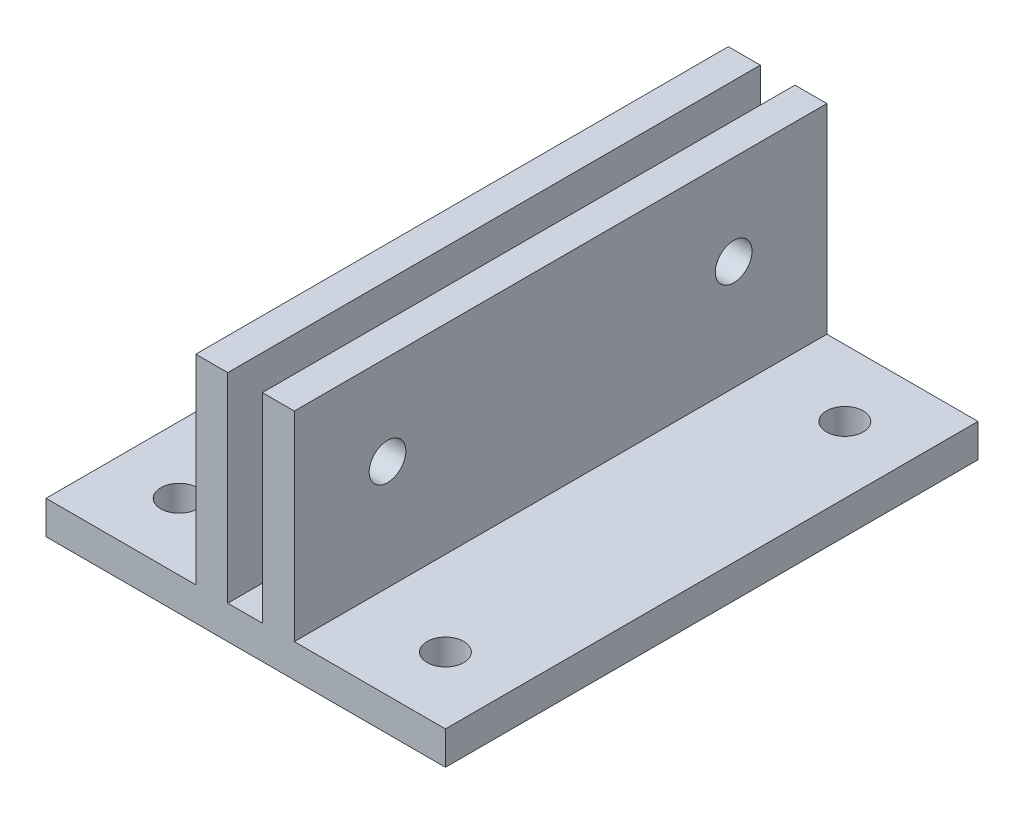
ISO-10303-21;
HEADER;
FILE_DESCRIPTION(('STEP AP214'),'2;1');
FILE_NAME('part.step','',(''),(''),'','','');
FILE_SCHEMA(('AUTOMOTIVE_DESIGN { 1 0 10303 214 1 1 1 1 }'));
ENDSEC;
DATA;
#1=APPLICATION_CONTEXT('core data for automotive mechanical design processes');
#2=APPLICATION_PROTOCOL_DEFINITION('international standard','automotive_design',2000,#1);
#3=PRODUCT_CONTEXT('',#1,'mechanical');
#4=PRODUCT('Part','Part','',(#3));
#5=PRODUCT_RELATED_PRODUCT_CATEGORY('part','',(#4));
#6=PRODUCT_DEFINITION_FORMATION('','',#4);
#7=PRODUCT_DEFINITION_CONTEXT('part definition',#1,'design');
#8=PRODUCT_DEFINITION('design','',#6,#7);
#9=PRODUCT_DEFINITION_SHAPE('','',#8);
#10=(LENGTH_UNIT() NAMED_UNIT(*) SI_UNIT(.MILLI.,.METRE.));
#11=(NAMED_UNIT(*) PLANE_ANGLE_UNIT() SI_UNIT($,.RADIAN.));
#12=(NAMED_UNIT(*) SI_UNIT($,.STERADIAN.) SOLID_ANGLE_UNIT());
#13=UNCERTAINTY_MEASURE_WITH_UNIT(LENGTH_MEASURE(1.E-05),#10,'distance_accuracy_value','');
#14=(GEOMETRIC_REPRESENTATION_CONTEXT(3) GLOBAL_UNCERTAINTY_ASSIGNED_CONTEXT((#13)) GLOBAL_UNIT_ASSIGNED_CONTEXT((#10,
#11,#12)) REPRESENTATION_CONTEXT('',''));
#15=CARTESIAN_POINT('',(0.,0.,0.));
#16=DIRECTION('',(0.,0.,1.));
#17=DIRECTION('',(1.,0.,0.));
#18=AXIS2_PLACEMENT_3D('',#15,#16,#17);
#19=CARTESIAN_POINT('',(0.,3.175,0.));
#20=DIRECTION('',(0.,-1.,0.));
#21=DIRECTION('',(0.,0.,-1.));
#22=AXIS2_PLACEMENT_3D('',#19,#20,#21);
#23=PLANE('',#22);
#24=DIRECTION('',(0.,0.,1.));
#25=VECTOR('',#24,1.);
#26=CARTESIAN_POINT('',(1.5875,3.175,25.4));
#27=LINE('',#26,#25);
#28=CARTESIAN_POINT('',(1.58749999999999,3.175,-25.4));
#29=VERTEX_POINT('',#28);
#30=CARTESIAN_POINT('',(1.58749999999999,3.175,25.4));
#31=VERTEX_POINT('',#30);
#32=EDGE_CURVE('E55',#29,#31,#27,.T.);
#33=ORIENTED_EDGE('',*,*,#32,.F.);
#34=DIRECTION('',(-1.,0.,0.));
#35=VECTOR('',#34,1.);
#36=CARTESIAN_POINT('',(-19.05,3.175,-25.4));
#37=LINE('',#36,#35);
#38=CARTESIAN_POINT('',(-1.7145,3.175,-25.4));
#39=VERTEX_POINT('',#38);
#40=EDGE_CURVE('E192',#29,#39,#37,.T.);
#41=ORIENTED_EDGE('',*,*,#40,.T.);
#42=DIRECTION('',(0.,0.,-1.));
#43=VECTOR('',#42,1.);
#44=CARTESIAN_POINT('',(-1.7145,3.175,25.4));
#45=LINE('',#44,#43);
#46=CARTESIAN_POINT('',(-1.71450000000001,3.175,25.4));
#47=VERTEX_POINT('',#46);
#48=EDGE_CURVE('E156',#47,#39,#45,.T.);
#49=ORIENTED_EDGE('',*,*,#48,.F.);
#50=DIRECTION('',(1.,0.,0.));
#51=VECTOR('',#50,1.);
#52=CARTESIAN_POINT('',(-19.05,3.175,25.4));
#53=LINE('',#52,#51);
#54=EDGE_CURVE('E198',#47,#31,#53,.T.);
#55=ORIENTED_EDGE('',*,*,#54,.T.);
#56=EDGE_LOOP('',(#33,#41,#49,#55));
#57=FACE_BOUND('',#56,.T.);
#58=ADVANCED_FACE('F38',(#57),#23,.F.);
#59=CARTESIAN_POINT('',(12.7,3.175,-19.05));
#60=DIRECTION('',(0.,1.,0.));
#61=DIRECTION('',(0.,0.,1.));
#62=AXIS2_PLACEMENT_3D('',#59,#60,#61);
#63=CIRCLE('',#62,1.75);
#64=CARTESIAN_POINT('',(12.7,3.175,-17.3));
#65=VERTEX_POINT('',#64);
#66=EDGE_CURVE('E237',#65,#65,#63,.T.);
#67=ORIENTED_EDGE('',*,*,#66,.F.);
#68=EDGE_LOOP('',(#67));
#69=FACE_BOUND('',#68,.T.);
#70=CARTESIAN_POINT('',(12.7,3.175,19.05));
#71=DIRECTION('',(0.,1.,0.));
#72=DIRECTION('',(0.,0.,1.));
#73=AXIS2_PLACEMENT_3D('',#70,#71,#72);
#74=CIRCLE('',#73,1.75);
#75=CARTESIAN_POINT('',(12.7,3.175,20.8));
#76=VERTEX_POINT('',#75);
#77=EDGE_CURVE('E248',#76,#76,#74,.T.);
#78=ORIENTED_EDGE('',*,*,#77,.F.);
#79=EDGE_LOOP('',(#78));
#80=FACE_BOUND('',#79,.T.);
#81=DIRECTION('',(0.,0.,-1.));
#82=VECTOR('',#81,1.);
#83=CARTESIAN_POINT('',(4.6355,3.175,25.4));
#84=LINE('',#83,#82);
#85=CARTESIAN_POINT('',(4.6355,3.175,25.4));
#86=VERTEX_POINT('',#85);
#87=CARTESIAN_POINT('',(4.63549999999999,3.175,-25.4));
#88=VERTEX_POINT('',#87);
#89=EDGE_CURVE('E150',#86,#88,#84,.T.);
#90=ORIENTED_EDGE('',*,*,#89,.F.);
#91=CARTESIAN_POINT('',(19.05,3.175,25.4));
#92=VERTEX_POINT('',#91);
#93=EDGE_CURVE('E194',#86,#92,#53,.T.);
#94=ORIENTED_EDGE('',*,*,#93,.T.);
#95=DIRECTION('',(0.,0.,-1.));
#96=VECTOR('',#95,1.);
#97=CARTESIAN_POINT('',(19.05,3.175,25.4));
#98=LINE('',#97,#96);
#99=CARTESIAN_POINT('',(19.05,3.175,-25.4));
#100=VERTEX_POINT('',#99);
#101=EDGE_CURVE('E186',#92,#100,#98,.T.);
#102=ORIENTED_EDGE('',*,*,#101,.T.);
#103=EDGE_CURVE('E63',#100,#88,#37,.T.);
#104=ORIENTED_EDGE('',*,*,#103,.T.);
#105=EDGE_LOOP('',(#90,#94,#102,#104));
#106=FACE_BOUND('',#105,.T.);
#107=ADVANCED_FACE('F272',(#69,#80,#106),#23,.F.);
#108=CARTESIAN_POINT('',(-12.7,3.175,19.05));
#109=DIRECTION('',(0.,1.,0.));
#110=DIRECTION('',(0.,0.,1.));
#111=AXIS2_PLACEMENT_3D('',#108,#109,#110);
#112=CIRCLE('',#111,1.75);
#113=CARTESIAN_POINT('',(-12.7,3.175,20.8));
#114=VERTEX_POINT('',#113);
#115=EDGE_CURVE('E242',#114,#114,#112,.T.);
#116=ORIENTED_EDGE('',*,*,#115,.F.);
#117=EDGE_LOOP('',(#116));
#118=FACE_BOUND('',#117,.T.);
#119=CARTESIAN_POINT('',(-12.7,3.175,-19.05));
#120=DIRECTION('',(0.,1.,0.));
#121=DIRECTION('',(0.,0.,1.));
#122=AXIS2_PLACEMENT_3D('',#119,#120,#121);
#123=CIRCLE('',#122,1.75);
#124=CARTESIAN_POINT('',(-12.7,3.175,-17.3));
#125=VERTEX_POINT('',#124);
#126=EDGE_CURVE('E241',#125,#125,#123,.T.);
#127=ORIENTED_EDGE('',*,*,#126,.F.);
#128=EDGE_LOOP('',(#127));
#129=FACE_BOUND('',#128,.T.);
#130=DIRECTION('',(0.,0.,1.));
#131=VECTOR('',#130,1.);
#132=CARTESIAN_POINT('',(-4.7625,3.175,25.4));
#133=LINE('',#132,#131);
#134=CARTESIAN_POINT('',(-4.7625,3.175,-25.4));
#135=VERTEX_POINT('',#134);
#136=CARTESIAN_POINT('',(-4.7625,3.175,25.4));
#137=VERTEX_POINT('',#136);
#138=EDGE_CURVE('E153',#135,#137,#133,.T.);
#139=ORIENTED_EDGE('',*,*,#138,.F.);
#140=CARTESIAN_POINT('',(-19.05,3.175,-25.4));
#141=VERTEX_POINT('',#140);
#142=EDGE_CURVE('E188',#135,#141,#37,.T.);
#143=ORIENTED_EDGE('',*,*,#142,.T.);
#144=DIRECTION('',(0.,0.,1.));
#145=VECTOR('',#144,1.);
#146=CARTESIAN_POINT('',(-19.05,3.175,25.4));
#147=LINE('',#146,#145);
#148=CARTESIAN_POINT('',(-19.05,3.175,25.4));
#149=VERTEX_POINT('',#148);
#150=EDGE_CURVE('E191',#141,#149,#147,.T.);
#151=ORIENTED_EDGE('',*,*,#150,.T.);
#152=EDGE_CURVE('E195',#149,#137,#53,.T.);
#153=ORIENTED_EDGE('',*,*,#152,.T.);
#154=EDGE_LOOP('',(#139,#143,#151,#153));
#155=FACE_BOUND('',#154,.T.);
#156=ADVANCED_FACE('F303',(#118,#129,#155),#23,.F.);
#157=CARTESIAN_POINT('',(19.05,3.175,25.4));
#158=DIRECTION('',(-1.,0.,0.));
#159=DIRECTION('',(0.,0.,1.));
#160=AXIS2_PLACEMENT_3D('',#157,#158,#159);
#161=PLANE('',#160);
#162=DIRECTION('',(0.,0.,-1.));
#163=VECTOR('',#162,1.);
#164=CARTESIAN_POINT('',(19.05,0.,25.4));
#165=LINE('',#164,#163);
#166=CARTESIAN_POINT('',(19.05,0.,25.4));
#167=VERTEX_POINT('',#166);
#168=CARTESIAN_POINT('',(19.05,0.,-25.4));
#169=VERTEX_POINT('',#168);
#170=EDGE_CURVE('E185',#167,#169,#165,.T.);
#171=ORIENTED_EDGE('',*,*,#170,.T.);
#172=DIRECTION('',(0.,-1.,0.));
#173=VECTOR('',#172,1.);
#174=CARTESIAN_POINT('',(19.05,3.175,-25.4));
#175=LINE('',#174,#173);
#176=EDGE_CURVE('E11',#100,#169,#175,.T.);
#177=ORIENTED_EDGE('',*,*,#176,.F.);
#178=ORIENTED_EDGE('',*,*,#101,.F.);
#179=DIRECTION('',(0.,-1.,0.));
#180=VECTOR('',#179,1.);
#181=CARTESIAN_POINT('',(19.05,3.175,25.4));
#182=LINE('',#181,#180);
#183=EDGE_CURVE('E197',#92,#167,#182,.T.);
#184=ORIENTED_EDGE('',*,*,#183,.T.);
#185=EDGE_LOOP('',(#171,#177,#178,#184));
#186=FACE_BOUND('',#185,.T.);
#187=ADVANCED_FACE('F40',(#186),#161,.F.);
#188=CARTESIAN_POINT('',(-19.05,3.175,-25.4));
#189=DIRECTION('',(0.,0.,1.));
#190=DIRECTION('',(1.,0.,0.));
#191=AXIS2_PLACEMENT_3D('',#188,#189,#190);
#192=PLANE('',#191);
#193=DIRECTION('',(-1.,0.,0.));
#194=VECTOR('',#193,1.);
#195=CARTESIAN_POINT('',(-19.05,0.,-25.4));
#196=LINE('',#195,#194);
#197=CARTESIAN_POINT('',(-19.05,0.,-25.4));
#198=VERTEX_POINT('',#197);
#199=EDGE_CURVE('E201',#169,#198,#196,.T.);
#200=ORIENTED_EDGE('',*,*,#199,.T.);
#201=DIRECTION('',(0.,-1.,0.));
#202=VECTOR('',#201,1.);
#203=CARTESIAN_POINT('',(-19.05,3.175,-25.4));
#204=LINE('',#203,#202);
#205=EDGE_CURVE('E47',#141,#198,#204,.T.);
#206=ORIENTED_EDGE('',*,*,#205,.F.);
#207=ORIENTED_EDGE('',*,*,#142,.F.);
#208=DIRECTION('',(0.,-1.,0.));
#209=VECTOR('',#208,1.);
#210=CARTESIAN_POINT('',(-4.7625,22.225,-25.4));
#211=LINE('',#210,#209);
#212=CARTESIAN_POINT('',(-4.7625,22.225,-25.4));
#213=VERTEX_POINT('',#212);
#214=EDGE_CURVE('E170',#213,#135,#211,.T.);
#215=ORIENTED_EDGE('',*,*,#214,.F.);
#216=DIRECTION('',(-1.,0.,0.));
#217=VECTOR('',#216,1.);
#218=CARTESIAN_POINT('',(-4.7625,22.225,-25.4));
#219=LINE('',#218,#217);
#220=CARTESIAN_POINT('',(-1.7145,22.225,-25.4));
#221=VERTEX_POINT('',#220);
#222=EDGE_CURVE('E169',#221,#213,#219,.T.);
#223=ORIENTED_EDGE('',*,*,#222,.F.);
#224=DIRECTION('',(0.,-1.,0.));
#225=VECTOR('',#224,1.);
#226=CARTESIAN_POINT('',(-1.7145,22.225,-25.4));
#227=LINE('',#226,#225);
#228=EDGE_CURVE('E176',#221,#39,#227,.T.);
#229=ORIENTED_EDGE('',*,*,#228,.T.);
#230=ORIENTED_EDGE('',*,*,#40,.F.);
#231=DIRECTION('',(0.,-1.,0.));
#232=VECTOR('',#231,1.);
#233=CARTESIAN_POINT('',(1.5875,22.225,-25.4));
#234=LINE('',#233,#232);
#235=CARTESIAN_POINT('',(1.5875,22.225,-25.4));
#236=VERTEX_POINT('',#235);
#237=EDGE_CURVE('E263',#236,#29,#234,.T.);
#238=ORIENTED_EDGE('',*,*,#237,.F.);
#239=DIRECTION('',(-1.,0.,0.));
#240=VECTOR('',#239,1.);
#241=CARTESIAN_POINT('',(1.5875,22.225,-25.4));
#242=LINE('',#241,#240);
#243=CARTESIAN_POINT('',(4.6355,22.225,-25.4));
#244=VERTEX_POINT('',#243);
#245=EDGE_CURVE('E146',#244,#236,#242,.T.);
#246=ORIENTED_EDGE('',*,*,#245,.F.);
#247=DIRECTION('',(0.,-1.,0.));
#248=VECTOR('',#247,1.);
#249=CARTESIAN_POINT('',(4.6355,22.225,-25.4));
#250=LINE('',#249,#248);
#251=EDGE_CURVE('E158',#244,#88,#250,.T.);
#252=ORIENTED_EDGE('',*,*,#251,.T.);
#253=ORIENTED_EDGE('',*,*,#103,.F.);
#254=ORIENTED_EDGE('',*,*,#176,.T.);
#255=EDGE_LOOP('',(#200,#206,#207,#215,#223,#229,#230,#238,#246,#252,#253,#254));
#256=FACE_BOUND('',#255,.T.);
#257=ADVANCED_FACE('F269',(#256),#192,.F.);
#258=CARTESIAN_POINT('',(-19.05,3.175,25.4));
#259=DIRECTION('',(1.,0.,0.));
#260=DIRECTION('',(0.,0.,-1.));
#261=AXIS2_PLACEMENT_3D('',#258,#259,#260);
#262=PLANE('',#261);
#263=DIRECTION('',(0.,0.,1.));
#264=VECTOR('',#263,1.);
#265=CARTESIAN_POINT('',(-19.05,0.,25.4));
#266=LINE('',#265,#264);
#267=CARTESIAN_POINT('',(-19.05,0.,25.4));
#268=VERTEX_POINT('',#267);
#269=EDGE_CURVE('E203',#198,#268,#266,.T.);
#270=ORIENTED_EDGE('',*,*,#269,.T.);
#271=DIRECTION('',(0.,-1.,0.));
#272=VECTOR('',#271,1.);
#273=CARTESIAN_POINT('',(-19.05,3.175,25.4));
#274=LINE('',#273,#272);
#275=EDGE_CURVE('E208',#149,#268,#274,.T.);
#276=ORIENTED_EDGE('',*,*,#275,.F.);
#277=ORIENTED_EDGE('',*,*,#150,.F.);
#278=ORIENTED_EDGE('',*,*,#205,.T.);
#279=EDGE_LOOP('',(#270,#276,#277,#278));
#280=FACE_BOUND('',#279,.T.);
#281=ADVANCED_FACE('F285',(#280),#262,.F.);
#282=CARTESIAN_POINT('',(-19.05,3.175,25.4));
#283=DIRECTION('',(0.,0.,-1.));
#284=DIRECTION('',(-1.,0.,0.));
#285=AXIS2_PLACEMENT_3D('',#282,#283,#284);
#286=PLANE('',#285);
#287=DIRECTION('',(1.,0.,0.));
#288=VECTOR('',#287,1.);
#289=CARTESIAN_POINT('',(-19.05,0.,25.4));
#290=LINE('',#289,#288);
#291=EDGE_CURVE('E189',#268,#167,#290,.T.);
#292=ORIENTED_EDGE('',*,*,#291,.T.);
#293=ORIENTED_EDGE('',*,*,#183,.F.);
#294=ORIENTED_EDGE('',*,*,#93,.F.);
#295=DIRECTION('',(0.,-1.,0.));
#296=VECTOR('',#295,1.);
#297=CARTESIAN_POINT('',(4.6355,22.225,25.4));
#298=LINE('',#297,#296);
#299=CARTESIAN_POINT('',(4.6355,22.225,25.4));
#300=VERTEX_POINT('',#299);
#301=EDGE_CURVE('E137',#300,#86,#298,.T.);
#302=ORIENTED_EDGE('',*,*,#301,.F.);
#303=DIRECTION('',(1.,0.,0.));
#304=VECTOR('',#303,1.);
#305=CARTESIAN_POINT('',(1.5875,22.225,25.4));
#306=LINE('',#305,#304);
#307=CARTESIAN_POINT('',(1.5875,22.225,25.4));
#308=VERTEX_POINT('',#307);
#309=EDGE_CURVE('E130',#308,#300,#306,.T.);
#310=ORIENTED_EDGE('',*,*,#309,.F.);
#311=DIRECTION('',(0.,-1.,0.));
#312=VECTOR('',#311,1.);
#313=CARTESIAN_POINT('',(1.5875,22.225,25.4));
#314=LINE('',#313,#312);
#315=EDGE_CURVE('E135',#308,#31,#314,.T.);
#316=ORIENTED_EDGE('',*,*,#315,.T.);
#317=ORIENTED_EDGE('',*,*,#54,.F.);
#318=DIRECTION('',(0.,-1.,0.));
#319=VECTOR('',#318,1.);
#320=CARTESIAN_POINT('',(-1.7145,22.225,25.4));
#321=LINE('',#320,#319);
#322=CARTESIAN_POINT('',(-1.7145,22.225,25.4));
#323=VERTEX_POINT('',#322);
#324=EDGE_CURVE('E179',#323,#47,#321,.T.);
#325=ORIENTED_EDGE('',*,*,#324,.F.);
#326=DIRECTION('',(1.,0.,0.));
#327=VECTOR('',#326,1.);
#328=CARTESIAN_POINT('',(-4.7625,22.225,25.4));
#329=LINE('',#328,#327);
#330=CARTESIAN_POINT('',(-4.7625,22.225,25.4));
#331=VERTEX_POINT('',#330);
#332=EDGE_CURVE('E165',#331,#323,#329,.T.);
#333=ORIENTED_EDGE('',*,*,#332,.F.);
#334=DIRECTION('',(0.,-1.,0.));
#335=VECTOR('',#334,1.);
#336=CARTESIAN_POINT('',(-4.7625,22.225,25.4));
#337=LINE('',#336,#335);
#338=EDGE_CURVE('E182',#331,#137,#337,.T.);
#339=ORIENTED_EDGE('',*,*,#338,.T.);
#340=ORIENTED_EDGE('',*,*,#152,.F.);
#341=ORIENTED_EDGE('',*,*,#275,.T.);
#342=EDGE_LOOP('',(#292,#293,#294,#302,#310,#316,#317,#325,#333,#339,#340,#341));
#343=FACE_BOUND('',#342,.T.);
#344=ADVANCED_FACE('F132',(#343),#286,.F.);
#345=CARTESIAN_POINT('',(0.,0.,0.));
#346=DIRECTION('',(0.,-1.,0.));
#347=DIRECTION('',(0.,0.,-1.));
#348=AXIS2_PLACEMENT_3D('',#345,#346,#347);
#349=PLANE('',#348);
#350=CARTESIAN_POINT('',(12.7,0.,-19.05));
#351=DIRECTION('',(0.,1.,0.));
#352=DIRECTION('',(0.,0.,1.));
#353=AXIS2_PLACEMENT_3D('',#350,#351,#352);
#354=CIRCLE('',#353,1.75);
#355=CARTESIAN_POINT('',(12.7,0.,-17.3));
#356=VERTEX_POINT('',#355);
#357=EDGE_CURVE('E251',#356,#356,#354,.T.);
#358=ORIENTED_EDGE('',*,*,#357,.T.);
#359=EDGE_LOOP('',(#358));
#360=FACE_BOUND('',#359,.T.);
#361=CARTESIAN_POINT('',(12.7,0.,19.05));
#362=DIRECTION('',(0.,1.,0.));
#363=DIRECTION('',(0.,0.,1.));
#364=AXIS2_PLACEMENT_3D('',#361,#362,#363);
#365=CIRCLE('',#364,1.75);
#366=CARTESIAN_POINT('',(12.7,0.,20.8));
#367=VERTEX_POINT('',#366);
#368=EDGE_CURVE('E245',#367,#367,#365,.T.);
#369=ORIENTED_EDGE('',*,*,#368,.T.);
#370=EDGE_LOOP('',(#369));
#371=FACE_BOUND('',#370,.T.);
#372=CARTESIAN_POINT('',(-12.7,0.,19.05));
#373=DIRECTION('',(0.,1.,0.));
#374=DIRECTION('',(0.,0.,1.));
#375=AXIS2_PLACEMENT_3D('',#372,#373,#374);
#376=CIRCLE('',#375,1.75);
#377=CARTESIAN_POINT('',(-12.7,0.,20.8));
#378=VERTEX_POINT('',#377);
#379=EDGE_CURVE('E238',#378,#378,#376,.T.);
#380=ORIENTED_EDGE('',*,*,#379,.T.);
#381=EDGE_LOOP('',(#380));
#382=FACE_BOUND('',#381,.T.);
#383=CARTESIAN_POINT('',(-12.7,0.,-19.05));
#384=DIRECTION('',(0.,1.,0.));
#385=DIRECTION('',(0.,0.,1.));
#386=AXIS2_PLACEMENT_3D('',#383,#384,#385);
#387=CIRCLE('',#386,1.75);
#388=CARTESIAN_POINT('',(-12.7,0.,-17.3));
#389=VERTEX_POINT('',#388);
#390=EDGE_CURVE('E256',#389,#389,#387,.T.);
#391=ORIENTED_EDGE('',*,*,#390,.T.);
#392=EDGE_LOOP('',(#391));
#393=FACE_BOUND('',#392,.T.);
#394=ORIENTED_EDGE('',*,*,#170,.F.);
#395=ORIENTED_EDGE('',*,*,#291,.F.);
#396=ORIENTED_EDGE('',*,*,#269,.F.);
#397=ORIENTED_EDGE('',*,*,#199,.F.);
#398=EDGE_LOOP('',(#394,#395,#396,#397));
#399=FACE_BOUND('',#398,.T.);
#400=ADVANCED_FACE('F287',(#360,#371,#382,#393,#399),#349,.T.);
#401=CARTESIAN_POINT('',(-4.7625,22.225,25.4));
#402=DIRECTION('',(1.,0.,0.));
#403=DIRECTION('',(0.,0.,-1.));
#404=AXIS2_PLACEMENT_3D('',#401,#402,#403);
#405=PLANE('',#404);
#406=CARTESIAN_POINT('',(-4.7625,13.6128328466343,-16.51));
#407=DIRECTION('',(-1.,0.,0.));
#408=DIRECTION('',(0.,0.,1.));
#409=AXIS2_PLACEMENT_3D('',#406,#407,#408);
#410=CIRCLE('',#409,1.75);
#411=CARTESIAN_POINT('',(-4.7625,13.6128328466343,-14.76));
#412=VERTEX_POINT('',#411);
#413=EDGE_CURVE('E215',#412,#412,#410,.T.);
#414=ORIENTED_EDGE('',*,*,#413,.F.);
#415=EDGE_LOOP('',(#414));
#416=FACE_BOUND('',#415,.T.);
#417=CARTESIAN_POINT('',(-4.7625,13.6128328466343,16.51));
#418=DIRECTION('',(-1.,0.,0.));
#419=DIRECTION('',(0.,0.,1.));
#420=AXIS2_PLACEMENT_3D('',#417,#418,#419);
#421=CIRCLE('',#420,1.75);
#422=CARTESIAN_POINT('',(-4.7625,13.6128328466343,18.26));
#423=VERTEX_POINT('',#422);
#424=EDGE_CURVE('E222',#423,#423,#421,.T.);
#425=ORIENTED_EDGE('',*,*,#424,.F.);
#426=EDGE_LOOP('',(#425));
#427=FACE_BOUND('',#426,.T.);
#428=ORIENTED_EDGE('',*,*,#138,.T.);
#429=ORIENTED_EDGE('',*,*,#338,.F.);
#430=DIRECTION('',(0.,0.,1.));
#431=VECTOR('',#430,1.);
#432=CARTESIAN_POINT('',(-4.7625,22.225,25.4));
#433=LINE('',#432,#431);
#434=EDGE_CURVE('E162',#213,#331,#433,.T.);
#435=ORIENTED_EDGE('',*,*,#434,.F.);
#436=ORIENTED_EDGE('',*,*,#214,.T.);
#437=EDGE_LOOP('',(#428,#429,#435,#436));
#438=FACE_BOUND('',#437,.T.);
#439=ADVANCED_FACE('F289',(#416,#427,#438),#405,.F.);
#440=CARTESIAN_POINT('',(-1.7145,22.225,25.4));
#441=DIRECTION('',(-1.,0.,0.));
#442=DIRECTION('',(0.,0.,1.));
#443=AXIS2_PLACEMENT_3D('',#440,#441,#442);
#444=PLANE('',#443);
#445=CARTESIAN_POINT('',(-1.7145,13.6128328466343,-16.51));
#446=DIRECTION('',(-1.,0.,0.));
#447=DIRECTION('',(0.,0.,1.));
#448=AXIS2_PLACEMENT_3D('',#445,#446,#447);
#449=CIRCLE('',#448,1.75);
#450=CARTESIAN_POINT('',(-1.71449999999999,13.6128328466343,-14.76));
#451=VERTEX_POINT('',#450);
#452=EDGE_CURVE('E234',#451,#451,#449,.T.);
#453=ORIENTED_EDGE('',*,*,#452,.T.);
#454=EDGE_LOOP('',(#453));
#455=FACE_BOUND('',#454,.T.);
#456=CARTESIAN_POINT('',(-1.7145,13.6128328466343,16.51));
#457=DIRECTION('',(-1.,0.,0.));
#458=DIRECTION('',(0.,0.,1.));
#459=AXIS2_PLACEMENT_3D('',#456,#457,#458);
#460=CIRCLE('',#459,1.75);
#461=CARTESIAN_POINT('',(-1.71449999999999,13.6128328466343,18.26));
#462=VERTEX_POINT('',#461);
#463=EDGE_CURVE('E219',#462,#462,#460,.T.);
#464=ORIENTED_EDGE('',*,*,#463,.T.);
#465=EDGE_LOOP('',(#464));
#466=FACE_BOUND('',#465,.T.);
#467=ORIENTED_EDGE('',*,*,#48,.T.);
#468=ORIENTED_EDGE('',*,*,#228,.F.);
#469=DIRECTION('',(0.,0.,-1.));
#470=VECTOR('',#469,1.);
#471=CARTESIAN_POINT('',(-1.7145,22.225,25.4));
#472=LINE('',#471,#470);
#473=EDGE_CURVE('E167',#323,#221,#472,.T.);
#474=ORIENTED_EDGE('',*,*,#473,.F.);
#475=ORIENTED_EDGE('',*,*,#324,.T.);
#476=EDGE_LOOP('',(#467,#468,#474,#475));
#477=FACE_BOUND('',#476,.T.);
#478=ADVANCED_FACE('F296',(#455,#466,#477),#444,.F.);
#479=CARTESIAN_POINT('',(0.,22.225,0.));
#480=DIRECTION('',(0.,-1.,0.));
#481=DIRECTION('',(0.,0.,-1.));
#482=AXIS2_PLACEMENT_3D('',#479,#480,#481);
#483=PLANE('',#482);
#484=ORIENTED_EDGE('',*,*,#434,.T.);
#485=ORIENTED_EDGE('',*,*,#332,.T.);
#486=ORIENTED_EDGE('',*,*,#473,.T.);
#487=ORIENTED_EDGE('',*,*,#222,.T.);
#488=EDGE_LOOP('',(#484,#485,#486,#487));
#489=FACE_BOUND('',#488,.T.);
#490=ADVANCED_FACE('F324',(#489),#483,.F.);
#491=CARTESIAN_POINT('',(1.5875,22.225,25.4));
#492=DIRECTION('',(1.,0.,0.));
#493=DIRECTION('',(0.,0.,-1.));
#494=AXIS2_PLACEMENT_3D('',#491,#492,#493);
#495=PLANE('',#494);
#496=CARTESIAN_POINT('',(1.5875,13.6128328466343,-16.51));
#497=DIRECTION('',(1.,0.,0.));
#498=DIRECTION('',(0.,0.,-1.));
#499=AXIS2_PLACEMENT_3D('',#496,#497,#498);
#500=CIRCLE('',#499,1.75);
#501=CARTESIAN_POINT('',(1.5875,13.6128328466343,-14.76));
#502=VERTEX_POINT('',#501);
#503=EDGE_CURVE('E231',#502,#502,#500,.T.);
#504=ORIENTED_EDGE('',*,*,#503,.T.);
#505=EDGE_LOOP('',(#504));
#506=FACE_BOUND('',#505,.T.);
#507=CARTESIAN_POINT('',(1.5875,13.6128328466343,16.51));
#508=DIRECTION('',(1.,0.,0.));
#509=DIRECTION('',(0.,0.,-1.));
#510=AXIS2_PLACEMENT_3D('',#507,#508,#509);
#511=CIRCLE('',#510,1.75);
#512=CARTESIAN_POINT('',(1.5875,13.6128328466343,18.26));
#513=VERTEX_POINT('',#512);
#514=EDGE_CURVE('E214',#513,#513,#511,.T.);
#515=ORIENTED_EDGE('',*,*,#514,.T.);
#516=EDGE_LOOP('',(#515));
#517=FACE_BOUND('',#516,.T.);
#518=ORIENTED_EDGE('',*,*,#32,.T.);
#519=ORIENTED_EDGE('',*,*,#315,.F.);
#520=DIRECTION('',(0.,0.,1.));
#521=VECTOR('',#520,1.);
#522=CARTESIAN_POINT('',(1.5875,22.225,25.4));
#523=LINE('',#522,#521);
#524=EDGE_CURVE('E141',#236,#308,#523,.T.);
#525=ORIENTED_EDGE('',*,*,#524,.F.);
#526=ORIENTED_EDGE('',*,*,#237,.T.);
#527=EDGE_LOOP('',(#518,#519,#525,#526));
#528=FACE_BOUND('',#527,.T.);
#529=ADVANCED_FACE('F152',(#506,#517,#528),#495,.F.);
#530=CARTESIAN_POINT('',(4.6355,22.225,25.4));
#531=DIRECTION('',(-1.,0.,0.));
#532=DIRECTION('',(0.,0.,1.));
#533=AXIS2_PLACEMENT_3D('',#530,#531,#532);
#534=PLANE('',#533);
#535=CARTESIAN_POINT('',(4.6355,13.6128328466343,-16.51));
#536=DIRECTION('',(-1.,0.,0.));
#537=DIRECTION('',(0.,0.,1.));
#538=AXIS2_PLACEMENT_3D('',#535,#536,#537);
#539=CIRCLE('',#538,1.75);
#540=CARTESIAN_POINT('',(4.6355,13.6128328466343,-14.76));
#541=VERTEX_POINT('',#540);
#542=EDGE_CURVE('E42',#541,#541,#539,.T.);
#543=ORIENTED_EDGE('',*,*,#542,.T.);
#544=EDGE_LOOP('',(#543));
#545=FACE_BOUND('',#544,.T.);
#546=CARTESIAN_POINT('',(4.6355,13.6128328466343,16.51));
#547=DIRECTION('',(-1.,0.,0.));
#548=DIRECTION('',(0.,0.,1.));
#549=AXIS2_PLACEMENT_3D('',#546,#547,#548);
#550=CIRCLE('',#549,1.75);
#551=CARTESIAN_POINT('',(4.6355,13.6128328466343,18.26));
#552=VERTEX_POINT('',#551);
#553=EDGE_CURVE('E212',#552,#552,#550,.T.);
#554=ORIENTED_EDGE('',*,*,#553,.T.);
#555=EDGE_LOOP('',(#554));
#556=FACE_BOUND('',#555,.T.);
#557=ORIENTED_EDGE('',*,*,#89,.T.);
#558=ORIENTED_EDGE('',*,*,#251,.F.);
#559=DIRECTION('',(0.,0.,-1.));
#560=VECTOR('',#559,1.);
#561=CARTESIAN_POINT('',(4.6355,22.225,25.4));
#562=LINE('',#561,#560);
#563=EDGE_CURVE('E140',#300,#244,#562,.T.);
#564=ORIENTED_EDGE('',*,*,#563,.F.);
#565=ORIENTED_EDGE('',*,*,#301,.T.);
#566=EDGE_LOOP('',(#557,#558,#564,#565));
#567=FACE_BOUND('',#566,.T.);
#568=ADVANCED_FACE('F271',(#545,#556,#567),#534,.F.);
#569=CARTESIAN_POINT('',(0.,22.225,0.));
#570=DIRECTION('',(0.,-1.,0.));
#571=DIRECTION('',(0.,0.,-1.));
#572=AXIS2_PLACEMENT_3D('',#569,#570,#571);
#573=PLANE('',#572);
#574=ORIENTED_EDGE('',*,*,#524,.T.);
#575=ORIENTED_EDGE('',*,*,#309,.T.);
#576=ORIENTED_EDGE('',*,*,#563,.T.);
#577=ORIENTED_EDGE('',*,*,#245,.T.);
#578=EDGE_LOOP('',(#574,#575,#576,#577));
#579=FACE_BOUND('',#578,.T.);
#580=ADVANCED_FACE('F144',(#579),#573,.F.);
#581=CARTESIAN_POINT('',(-12.7,0.,-19.05));
#582=DIRECTION('',(0.,1.,0.));
#583=DIRECTION('',(0.,0.,1.));
#584=AXIS2_PLACEMENT_3D('',#581,#582,#583);
#585=CYLINDRICAL_SURFACE('',#584,1.75);
#586=ORIENTED_EDGE('',*,*,#390,.F.);
#587=EDGE_LOOP('',(#586));
#588=FACE_BOUND('',#587,.T.);
#589=ORIENTED_EDGE('',*,*,#126,.T.);
#590=EDGE_LOOP('',(#589));
#591=FACE_BOUND('',#590,.T.);
#592=ADVANCED_FACE('F346',(#588,#591),#585,.F.);
#593=CARTESIAN_POINT('',(-12.7,0.,19.05));
#594=DIRECTION('',(0.,1.,0.));
#595=DIRECTION('',(0.,0.,1.));
#596=AXIS2_PLACEMENT_3D('',#593,#594,#595);
#597=CYLINDRICAL_SURFACE('',#596,1.75);
#598=ORIENTED_EDGE('',*,*,#379,.F.);
#599=EDGE_LOOP('',(#598));
#600=FACE_BOUND('',#599,.T.);
#601=ORIENTED_EDGE('',*,*,#115,.T.);
#602=EDGE_LOOP('',(#601));
#603=FACE_BOUND('',#602,.T.);
#604=ADVANCED_FACE('F349',(#600,#603),#597,.F.);
#605=CARTESIAN_POINT('',(12.7,0.,19.05));
#606=DIRECTION('',(0.,1.,0.));
#607=DIRECTION('',(0.,0.,1.));
#608=AXIS2_PLACEMENT_3D('',#605,#606,#607);
#609=CYLINDRICAL_SURFACE('',#608,1.75);
#610=ORIENTED_EDGE('',*,*,#368,.F.);
#611=EDGE_LOOP('',(#610));
#612=FACE_BOUND('',#611,.T.);
#613=ORIENTED_EDGE('',*,*,#77,.T.);
#614=EDGE_LOOP('',(#613));
#615=FACE_BOUND('',#614,.T.);
#616=ADVANCED_FACE('F355',(#612,#615),#609,.F.);
#617=CARTESIAN_POINT('',(12.7,0.,-19.05));
#618=DIRECTION('',(0.,1.,0.));
#619=DIRECTION('',(0.,0.,1.));
#620=AXIS2_PLACEMENT_3D('',#617,#618,#619);
#621=CYLINDRICAL_SURFACE('',#620,1.75);
#622=ORIENTED_EDGE('',*,*,#357,.F.);
#623=EDGE_LOOP('',(#622));
#624=FACE_BOUND('',#623,.T.);
#625=ORIENTED_EDGE('',*,*,#66,.T.);
#626=EDGE_LOOP('',(#625));
#627=FACE_BOUND('',#626,.T.);
#628=ADVANCED_FACE('F351',(#624,#627),#621,.F.);
#629=CARTESIAN_POINT('',(19.05,13.6128328466343,16.51));
#630=DIRECTION('',(-1.,0.,0.));
#631=DIRECTION('',(0.,0.,1.));
#632=AXIS2_PLACEMENT_3D('',#629,#630,#631);
#633=CYLINDRICAL_SURFACE('',#632,1.75);
#634=CARTESIAN_POINT('',(4.6355,13.6128328466343,18.26));
#635=CARTESIAN_POINT('',(4.60375,13.6128328466343,18.26));
#636=CARTESIAN_POINT('',(4.572,13.6128328466343,18.26));
#637=CARTESIAN_POINT('',(4.5085,13.6128328466343,18.26));
#638=CARTESIAN_POINT('',(4.47675,13.6128328466343,18.26));
#639=CARTESIAN_POINT('',(4.41325,13.6128328466343,18.26));
#640=CARTESIAN_POINT('',(4.3815,13.6128328466343,18.26));
#641=CARTESIAN_POINT('',(4.318,13.6128328466343,18.26));
#642=CARTESIAN_POINT('',(4.28625,13.6128328466343,18.26));
#643=CARTESIAN_POINT('',(4.22275,13.6128328466343,18.26));
#644=CARTESIAN_POINT('',(4.191,13.6128328466343,18.26));
#645=CARTESIAN_POINT('',(4.1275,13.6128328466343,18.26));
#646=CARTESIAN_POINT('',(4.09575,13.6128328466343,18.26));
#647=CARTESIAN_POINT('',(4.03225,13.6128328466343,18.26));
#648=CARTESIAN_POINT('',(4.0005,13.6128328466343,18.26));
#649=CARTESIAN_POINT('',(3.937,13.6128328466343,18.26));
#650=CARTESIAN_POINT('',(3.90525,13.6128328466343,18.26));
#651=CARTESIAN_POINT('',(3.84175,13.6128328466343,18.26));
#652=CARTESIAN_POINT('',(3.81,13.6128328466343,18.26));
#653=CARTESIAN_POINT('',(3.7465,13.6128328466343,18.26));
#654=CARTESIAN_POINT('',(3.71475,13.6128328466343,18.26));
#655=CARTESIAN_POINT('',(3.65125,13.6128328466343,18.26));
#656=CARTESIAN_POINT('',(3.6195,13.6128328466343,18.26));
#657=CARTESIAN_POINT('',(3.556,13.6128328466343,18.26));
#658=CARTESIAN_POINT('',(3.52425,13.6128328466343,18.26));
#659=CARTESIAN_POINT('',(3.46075,13.6128328466343,18.26));
#660=CARTESIAN_POINT('',(3.429,13.6128328466343,18.26));
#661=CARTESIAN_POINT('',(3.3655,13.6128328466343,18.26));
#662=CARTESIAN_POINT('',(3.33375,13.6128328466343,18.26));
#663=CARTESIAN_POINT('',(3.27025,13.6128328466343,18.26));
#664=CARTESIAN_POINT('',(3.2385,13.6128328466343,18.26));
#665=CARTESIAN_POINT('',(3.175,13.6128328466343,18.26));
#666=CARTESIAN_POINT('',(3.14325,13.6128328466343,18.26));
#667=CARTESIAN_POINT('',(3.07975,13.6128328466343,18.26));
#668=CARTESIAN_POINT('',(3.048,13.6128328466343,18.26));
#669=CARTESIAN_POINT('',(2.9845,13.6128328466343,18.26));
#670=CARTESIAN_POINT('',(2.95275,13.6128328466343,18.26));
#671=CARTESIAN_POINT('',(2.88925,13.6128328466343,18.26));
#672=CARTESIAN_POINT('',(2.8575,13.6128328466343,18.26));
#673=CARTESIAN_POINT('',(2.794,13.6128328466343,18.26));
#674=CARTESIAN_POINT('',(2.76225,13.6128328466343,18.26));
#675=CARTESIAN_POINT('',(2.69875,13.6128328466343,18.26));
#676=CARTESIAN_POINT('',(2.667,13.6128328466343,18.26));
#677=CARTESIAN_POINT('',(2.6035,13.6128328466343,18.26));
#678=CARTESIAN_POINT('',(2.57175,13.6128328466343,18.26));
#679=CARTESIAN_POINT('',(2.50825,13.6128328466343,18.26));
#680=CARTESIAN_POINT('',(2.4765,13.6128328466343,18.26));
#681=CARTESIAN_POINT('',(2.413,13.6128328466343,18.26));
#682=CARTESIAN_POINT('',(2.38125,13.6128328466343,18.26));
#683=CARTESIAN_POINT('',(2.31775,13.6128328466343,18.26));
#684=CARTESIAN_POINT('',(2.286,13.6128328466343,18.26));
#685=CARTESIAN_POINT('',(2.2225,13.6128328466343,18.26));
#686=CARTESIAN_POINT('',(2.19075,13.6128328466343,18.26));
#687=CARTESIAN_POINT('',(2.12725,13.6128328466343,18.26));
#688=CARTESIAN_POINT('',(2.0955,13.6128328466343,18.26));
#689=CARTESIAN_POINT('',(2.032,13.6128328466343,18.26));
#690=CARTESIAN_POINT('',(2.00025,13.6128328466343,18.26));
#691=CARTESIAN_POINT('',(1.93675,13.6128328466343,18.26));
#692=CARTESIAN_POINT('',(1.905,13.6128328466343,18.26));
#693=CARTESIAN_POINT('',(1.8415,13.6128328466343,18.26));
#694=CARTESIAN_POINT('',(1.80975,13.6128328466343,18.26));
#695=CARTESIAN_POINT('',(1.74625,13.6128328466343,18.26));
#696=CARTESIAN_POINT('',(1.7145,13.6128328466343,18.26));
#697=CARTESIAN_POINT('',(1.651,13.6128328466343,18.26));
#698=CARTESIAN_POINT('',(1.61925,13.6128328466343,18.26));
#699=CARTESIAN_POINT('',(1.5875,13.6128328466343,18.26));
#700=B_SPLINE_CURVE_WITH_KNOTS('',3,(#634,#635,#636,#637,#638,#639,#640,#641,#642,#643,#644,
#645,#646,#647,#648,#649,#650,#651,#652,#653,#654,#655,#656,#657,#658,#659,#660,#661,#662,#663,
#664,#665,#666,#667,#668,#669,#670,#671,#672,#673,#674,#675,#676,#677,#678,#679,#680,#681,#682,
#683,#684,#685,#686,#687,#688,#689,#690,#691,#692,#693,#694,#695,#696,#697,#698,#699),
.UNSPECIFIED.,.F.,.F.,(4,2,2,2,2,2,2,2,2,2,2,2,2,2,2,2,2,2,2,2,2,2,2,2,2,2,2,2,2,2,2,2,4),(0.,
0.0952499999999998,0.1905,0.285750000000001,0.381000000000001,0.476250000000001,
0.571500000000001,0.666750000000001,0.762000000000002,0.857250000000002,0.952500000000002,
1.04775,1.143,1.23825,1.3335,1.42875,1.524,1.61925,1.7145,1.80975,1.905,2.00025,2.0955,2.19075,
2.286,2.38125,2.4765,2.57175,2.667,2.76225,2.8575,2.95275,3.048),.UNSPECIFIED.);
#701=EDGE_CURVE('BSEAM354',#552,#513,#700,.T.);
#702=ORIENTED_EDGE('',*,*,#553,.F.);
#703=ORIENTED_EDGE('',*,*,#514,.F.);
#704=ORIENTED_EDGE('',*,*,#701,.T.);
#705=ORIENTED_EDGE('',*,*,#701,.F.);
#706=EDGE_LOOP('',(#702,#704,#703,#705));
#707=FACE_BOUND('',#706,.T.);
#708=ADVANCED_FACE('F354',(#707),#633,.F.);
#709=CARTESIAN_POINT('',(19.05,13.6128328466343,-16.51));
#710=DIRECTION('',(-1.,0.,0.));
#711=DIRECTION('',(0.,0.,1.));
#712=AXIS2_PLACEMENT_3D('',#709,#710,#711);
#713=CYLINDRICAL_SURFACE('',#712,1.75);
#714=CARTESIAN_POINT('',(4.6355,13.6128328466343,-14.76));
#715=CARTESIAN_POINT('',(4.60375,13.6128328466343,-14.76));
#716=CARTESIAN_POINT('',(4.572,13.6128328466343,-14.76));
#717=CARTESIAN_POINT('',(4.5085,13.6128328466343,-14.76));
#718=CARTESIAN_POINT('',(4.47675,13.6128328466343,-14.76));
#719=CARTESIAN_POINT('',(4.41325,13.6128328466343,-14.76));
#720=CARTESIAN_POINT('',(4.3815,13.6128328466343,-14.76));
#721=CARTESIAN_POINT('',(4.318,13.6128328466343,-14.76));
#722=CARTESIAN_POINT('',(4.28625,13.6128328466343,-14.76));
#723=CARTESIAN_POINT('',(4.22275,13.6128328466343,-14.76));
#724=CARTESIAN_POINT('',(4.191,13.6128328466343,-14.76));
#725=CARTESIAN_POINT('',(4.1275,13.6128328466343,-14.76));
#726=CARTESIAN_POINT('',(4.09575,13.6128328466343,-14.76));
#727=CARTESIAN_POINT('',(4.03225,13.6128328466343,-14.76));
#728=CARTESIAN_POINT('',(4.0005,13.6128328466343,-14.76));
#729=CARTESIAN_POINT('',(3.937,13.6128328466343,-14.76));
#730=CARTESIAN_POINT('',(3.90525,13.6128328466343,-14.76));
#731=CARTESIAN_POINT('',(3.84175,13.6128328466343,-14.76));
#732=CARTESIAN_POINT('',(3.81,13.6128328466343,-14.76));
#733=CARTESIAN_POINT('',(3.7465,13.6128328466343,-14.76));
#734=CARTESIAN_POINT('',(3.71475,13.6128328466343,-14.76));
#735=CARTESIAN_POINT('',(3.65125,13.6128328466343,-14.76));
#736=CARTESIAN_POINT('',(3.6195,13.6128328466343,-14.76));
#737=CARTESIAN_POINT('',(3.556,13.6128328466343,-14.76));
#738=CARTESIAN_POINT('',(3.52425,13.6128328466343,-14.76));
#739=CARTESIAN_POINT('',(3.46075,13.6128328466343,-14.76));
#740=CARTESIAN_POINT('',(3.429,13.6128328466343,-14.76));
#741=CARTESIAN_POINT('',(3.3655,13.6128328466343,-14.76));
#742=CARTESIAN_POINT('',(3.33375,13.6128328466343,-14.76));
#743=CARTESIAN_POINT('',(3.27025,13.6128328466343,-14.76));
#744=CARTESIAN_POINT('',(3.2385,13.6128328466343,-14.76));
#745=CARTESIAN_POINT('',(3.175,13.6128328466343,-14.76));
#746=CARTESIAN_POINT('',(3.14325,13.6128328466343,-14.76));
#747=CARTESIAN_POINT('',(3.07975,13.6128328466343,-14.76));
#748=CARTESIAN_POINT('',(3.048,13.6128328466343,-14.76));
#749=CARTESIAN_POINT('',(2.9845,13.6128328466343,-14.76));
#750=CARTESIAN_POINT('',(2.95275,13.6128328466343,-14.76));
#751=CARTESIAN_POINT('',(2.88925,13.6128328466343,-14.76));
#752=CARTESIAN_POINT('',(2.8575,13.6128328466343,-14.76));
#753=CARTESIAN_POINT('',(2.794,13.6128328466343,-14.76));
#754=CARTESIAN_POINT('',(2.76225,13.6128328466343,-14.76));
#755=CARTESIAN_POINT('',(2.69875,13.6128328466343,-14.76));
#756=CARTESIAN_POINT('',(2.667,13.6128328466343,-14.76));
#757=CARTESIAN_POINT('',(2.6035,13.6128328466343,-14.76));
#758=CARTESIAN_POINT('',(2.57175,13.6128328466343,-14.76));
#759=CARTESIAN_POINT('',(2.50825,13.6128328466343,-14.76));
#760=CARTESIAN_POINT('',(2.4765,13.6128328466343,-14.76));
#761=CARTESIAN_POINT('',(2.413,13.6128328466343,-14.76));
#762=CARTESIAN_POINT('',(2.38125,13.6128328466343,-14.76));
#763=CARTESIAN_POINT('',(2.31775,13.6128328466343,-14.76));
#764=CARTESIAN_POINT('',(2.286,13.6128328466343,-14.76));
#765=CARTESIAN_POINT('',(2.2225,13.6128328466343,-14.76));
#766=CARTESIAN_POINT('',(2.19075,13.6128328466343,-14.76));
#767=CARTESIAN_POINT('',(2.12725,13.6128328466343,-14.76));
#768=CARTESIAN_POINT('',(2.0955,13.6128328466343,-14.76));
#769=CARTESIAN_POINT('',(2.032,13.6128328466343,-14.76));
#770=CARTESIAN_POINT('',(2.00025,13.6128328466343,-14.76));
#771=CARTESIAN_POINT('',(1.93675,13.6128328466343,-14.76));
#772=CARTESIAN_POINT('',(1.905,13.6128328466343,-14.76));
#773=CARTESIAN_POINT('',(1.8415,13.6128328466343,-14.76));
#774=CARTESIAN_POINT('',(1.80975,13.6128328466343,-14.76));
#775=CARTESIAN_POINT('',(1.74625,13.6128328466343,-14.76));
#776=CARTESIAN_POINT('',(1.7145,13.6128328466343,-14.76));
#777=CARTESIAN_POINT('',(1.651,13.6128328466343,-14.76));
#778=CARTESIAN_POINT('',(1.61925,13.6128328466343,-14.76));
#779=CARTESIAN_POINT('',(1.5875,13.6128328466343,-14.76));
#780=B_SPLINE_CURVE_WITH_KNOTS('',3,(#714,#715,#716,#717,#718,#719,#720,#721,#722,#723,#724,
#725,#726,#727,#728,#729,#730,#731,#732,#733,#734,#735,#736,#737,#738,#739,#740,#741,#742,#743,
#744,#745,#746,#747,#748,#749,#750,#751,#752,#753,#754,#755,#756,#757,#758,#759,#760,#761,#762,
#763,#764,#765,#766,#767,#768,#769,#770,#771,#772,#773,#774,#775,#776,#777,#778,#779),
.UNSPECIFIED.,.F.,.F.,(4,2,2,2,2,2,2,2,2,2,2,2,2,2,2,2,2,2,2,2,2,2,2,2,2,2,2,2,2,2,2,2,4),(0.,
0.0952499999999998,0.1905,0.285750000000001,0.381000000000001,0.476250000000001,
0.571500000000001,0.666750000000001,0.762000000000002,0.857250000000002,0.952500000000002,
1.04775,1.143,1.23825,1.3335,1.42875,1.524,1.61925,1.7145,1.80975,1.905,2.00025,2.0955,2.19075,
2.286,2.38125,2.4765,2.57175,2.667,2.76225,2.8575,2.95275,3.048),.UNSPECIFIED.);
#781=EDGE_CURVE('BSEAM367',#541,#502,#780,.T.);
#782=ORIENTED_EDGE('',*,*,#542,.F.);
#783=ORIENTED_EDGE('',*,*,#503,.F.);
#784=ORIENTED_EDGE('',*,*,#781,.T.);
#785=ORIENTED_EDGE('',*,*,#781,.F.);
#786=EDGE_LOOP('',(#782,#784,#783,#785));
#787=FACE_BOUND('',#786,.T.);
#788=ADVANCED_FACE('F367',(#787),#713,.F.);
#789=CARTESIAN_POINT('',(-4.7625,13.6128328466343,18.26));
#790=CARTESIAN_POINT('',(-4.73075,13.6128328466343,18.26));
#791=CARTESIAN_POINT('',(-4.699,13.6128328466343,18.26));
#792=CARTESIAN_POINT('',(-4.6355,13.6128328466343,18.26));
#793=CARTESIAN_POINT('',(-4.60375,13.6128328466343,18.26));
#794=CARTESIAN_POINT('',(-4.54025,13.6128328466343,18.26));
#795=CARTESIAN_POINT('',(-4.5085,13.6128328466343,18.26));
#796=CARTESIAN_POINT('',(-4.445,13.6128328466343,18.26));
#797=CARTESIAN_POINT('',(-4.41325,13.6128328466343,18.26));
#798=CARTESIAN_POINT('',(-4.34975,13.6128328466343,18.26));
#799=CARTESIAN_POINT('',(-4.318,13.6128328466343,18.26));
#800=CARTESIAN_POINT('',(-4.2545,13.6128328466343,18.26));
#801=CARTESIAN_POINT('',(-4.22275,13.6128328466343,18.26));
#802=CARTESIAN_POINT('',(-4.15925,13.6128328466343,18.26));
#803=CARTESIAN_POINT('',(-4.1275,13.6128328466343,18.26));
#804=CARTESIAN_POINT('',(-4.064,13.6128328466343,18.26));
#805=CARTESIAN_POINT('',(-4.03225,13.6128328466343,18.26));
#806=CARTESIAN_POINT('',(-3.96875,13.6128328466343,18.26));
#807=CARTESIAN_POINT('',(-3.937,13.6128328466343,18.26));
#808=CARTESIAN_POINT('',(-3.8735,13.6128328466343,18.26));
#809=CARTESIAN_POINT('',(-3.84175,13.6128328466343,18.26));
#810=CARTESIAN_POINT('',(-3.77825,13.6128328466343,18.26));
#811=CARTESIAN_POINT('',(-3.7465,13.6128328466343,18.26));
#812=CARTESIAN_POINT('',(-3.683,13.6128328466343,18.26));
#813=CARTESIAN_POINT('',(-3.65125,13.6128328466343,18.26));
#814=CARTESIAN_POINT('',(-3.58775,13.6128328466343,18.26));
#815=CARTESIAN_POINT('',(-3.556,13.6128328466343,18.26));
#816=CARTESIAN_POINT('',(-3.4925,13.6128328466343,18.26));
#817=CARTESIAN_POINT('',(-3.46075,13.6128328466343,18.26));
#818=CARTESIAN_POINT('',(-3.39725,13.6128328466343,18.26));
#819=CARTESIAN_POINT('',(-3.3655,13.6128328466343,18.26));
#820=CARTESIAN_POINT('',(-3.302,13.6128328466343,18.26));
#821=CARTESIAN_POINT('',(-3.27025,13.6128328466343,18.26));
#822=CARTESIAN_POINT('',(-3.20675,13.6128328466343,18.26));
#823=CARTESIAN_POINT('',(-3.175,13.6128328466343,18.26));
#824=CARTESIAN_POINT('',(-3.1115,13.6128328466343,18.26));
#825=CARTESIAN_POINT('',(-3.07975,13.6128328466343,18.26));
#826=CARTESIAN_POINT('',(-3.01625,13.6128328466343,18.26));
#827=CARTESIAN_POINT('',(-2.9845,13.6128328466343,18.26));
#828=CARTESIAN_POINT('',(-2.921,13.6128328466343,18.26));
#829=CARTESIAN_POINT('',(-2.88925,13.6128328466343,18.26));
#830=CARTESIAN_POINT('',(-2.82575,13.6128328466343,18.26));
#831=CARTESIAN_POINT('',(-2.794,13.6128328466343,18.26));
#832=CARTESIAN_POINT('',(-2.7305,13.6128328466343,18.26));
#833=CARTESIAN_POINT('',(-2.69875,13.6128328466343,18.26));
#834=CARTESIAN_POINT('',(-2.63525,13.6128328466343,18.26));
#835=CARTESIAN_POINT('',(-2.6035,13.6128328466343,18.26));
#836=CARTESIAN_POINT('',(-2.54,13.6128328466343,18.26));
#837=CARTESIAN_POINT('',(-2.50825,13.6128328466343,18.26));
#838=CARTESIAN_POINT('',(-2.44475,13.6128328466343,18.26));
#839=CARTESIAN_POINT('',(-2.41299999999999,13.6128328466343,18.26));
#840=CARTESIAN_POINT('',(-2.3495,13.6128328466343,18.26));
#841=CARTESIAN_POINT('',(-2.31775,13.6128328466343,18.26));
#842=CARTESIAN_POINT('',(-2.25425,13.6128328466343,18.26));
#843=CARTESIAN_POINT('',(-2.2225,13.6128328466343,18.26));
#844=CARTESIAN_POINT('',(-2.15899999999999,13.6128328466343,18.26));
#845=CARTESIAN_POINT('',(-2.12724999999999,13.6128328466343,18.26));
#846=CARTESIAN_POINT('',(-2.06374999999999,13.6128328466343,18.26));
#847=CARTESIAN_POINT('',(-2.03199999999999,13.6128328466343,18.26));
#848=CARTESIAN_POINT('',(-1.96849999999999,13.6128328466343,18.26));
#849=CARTESIAN_POINT('',(-1.93674999999999,13.6128328466343,18.26));
#850=CARTESIAN_POINT('',(-1.87324999999999,13.6128328466343,18.26));
#851=CARTESIAN_POINT('',(-1.84149999999999,13.6128328466343,18.26));
#852=CARTESIAN_POINT('',(-1.77799999999999,13.6128328466343,18.26));
#853=CARTESIAN_POINT('',(-1.74624999999999,13.6128328466343,18.26));
#854=CARTESIAN_POINT('',(-1.71449999999999,13.6128328466343,18.26));
#855=B_SPLINE_CURVE_WITH_KNOTS('',3,(#789,#790,#791,#792,#793,#794,#795,#796,#797,#798,#799,
#800,#801,#802,#803,#804,#805,#806,#807,#808,#809,#810,#811,#812,#813,#814,#815,#816,#817,#818,
#819,#820,#821,#822,#823,#824,#825,#826,#827,#828,#829,#830,#831,#832,#833,#834,#835,#836,#837,
#838,#839,#840,#841,#842,#843,#844,#845,#846,#847,#848,#849,#850,#851,#852,#853,#854),
.UNSPECIFIED.,.F.,.F.,(4,2,2,2,2,2,2,2,2,2,2,2,2,2,2,2,2,2,2,2,2,2,2,2,2,2,2,2,2,2,2,2,4),(0.,
0.0952500000000016,0.1905,0.285750000000001,0.380999999999999,0.476250000000001,
0.571500000000003,0.666750000000001,0.762000000000002,0.857250000000004,0.952500000000002,
1.04775,1.14300000000001,1.23825,1.3335,1.42875,1.524,1.61925000000001,1.7145,1.80975000000001,
1.905,2.00025000000001,2.09550000000001,2.19075000000001,2.28600000000001,2.38125000000001,
2.47650000000001,2.57175000000001,2.66700000000001,2.76225000000001,2.85750000000001,
2.95275000000001,3.04800000000001),.UNSPECIFIED.);
#856=EDGE_CURVE('BSEAM363',#423,#462,#855,.T.);
#857=ORIENTED_EDGE('',*,*,#424,.T.);
#858=ORIENTED_EDGE('',*,*,#463,.F.);
#859=ORIENTED_EDGE('',*,*,#856,.T.);
#860=ORIENTED_EDGE('',*,*,#856,.F.);
#861=EDGE_LOOP('',(#857,#859,#858,#860));
#862=FACE_BOUND('',#861,.T.);
#863=ADVANCED_FACE('F363',(#862),#633,.F.);
#864=CARTESIAN_POINT('',(-4.7625,13.6128328466343,-14.76));
#865=CARTESIAN_POINT('',(-4.73075,13.6128328466343,-14.76));
#866=CARTESIAN_POINT('',(-4.699,13.6128328466343,-14.76));
#867=CARTESIAN_POINT('',(-4.6355,13.6128328466343,-14.76));
#868=CARTESIAN_POINT('',(-4.60375,13.6128328466343,-14.76));
#869=CARTESIAN_POINT('',(-4.54025,13.6128328466343,-14.76));
#870=CARTESIAN_POINT('',(-4.5085,13.6128328466343,-14.76));
#871=CARTESIAN_POINT('',(-4.445,13.6128328466343,-14.76));
#872=CARTESIAN_POINT('',(-4.41325,13.6128328466343,-14.76));
#873=CARTESIAN_POINT('',(-4.34975,13.6128328466343,-14.76));
#874=CARTESIAN_POINT('',(-4.318,13.6128328466343,-14.76));
#875=CARTESIAN_POINT('',(-4.2545,13.6128328466343,-14.76));
#876=CARTESIAN_POINT('',(-4.22275,13.6128328466343,-14.76));
#877=CARTESIAN_POINT('',(-4.15925,13.6128328466343,-14.76));
#878=CARTESIAN_POINT('',(-4.1275,13.6128328466343,-14.76));
#879=CARTESIAN_POINT('',(-4.064,13.6128328466343,-14.76));
#880=CARTESIAN_POINT('',(-4.03225,13.6128328466343,-14.76));
#881=CARTESIAN_POINT('',(-3.96875,13.6128328466343,-14.76));
#882=CARTESIAN_POINT('',(-3.937,13.6128328466343,-14.76));
#883=CARTESIAN_POINT('',(-3.8735,13.6128328466343,-14.76));
#884=CARTESIAN_POINT('',(-3.84175,13.6128328466343,-14.76));
#885=CARTESIAN_POINT('',(-3.77825,13.6128328466343,-14.76));
#886=CARTESIAN_POINT('',(-3.7465,13.6128328466343,-14.76));
#887=CARTESIAN_POINT('',(-3.683,13.6128328466343,-14.76));
#888=CARTESIAN_POINT('',(-3.65125,13.6128328466343,-14.76));
#889=CARTESIAN_POINT('',(-3.58775,13.6128328466343,-14.76));
#890=CARTESIAN_POINT('',(-3.556,13.6128328466343,-14.76));
#891=CARTESIAN_POINT('',(-3.4925,13.6128328466343,-14.76));
#892=CARTESIAN_POINT('',(-3.46075,13.6128328466343,-14.76));
#893=CARTESIAN_POINT('',(-3.39725,13.6128328466343,-14.76));
#894=CARTESIAN_POINT('',(-3.3655,13.6128328466343,-14.76));
#895=CARTESIAN_POINT('',(-3.302,13.6128328466343,-14.76));
#896=CARTESIAN_POINT('',(-3.27025,13.6128328466343,-14.76));
#897=CARTESIAN_POINT('',(-3.20675,13.6128328466343,-14.76));
#898=CARTESIAN_POINT('',(-3.175,13.6128328466343,-14.76));
#899=CARTESIAN_POINT('',(-3.1115,13.6128328466343,-14.76));
#900=CARTESIAN_POINT('',(-3.07975,13.6128328466343,-14.76));
#901=CARTESIAN_POINT('',(-3.01625,13.6128328466343,-14.76));
#902=CARTESIAN_POINT('',(-2.9845,13.6128328466343,-14.76));
#903=CARTESIAN_POINT('',(-2.921,13.6128328466343,-14.76));
#904=CARTESIAN_POINT('',(-2.88925,13.6128328466343,-14.76));
#905=CARTESIAN_POINT('',(-2.82575,13.6128328466343,-14.76));
#906=CARTESIAN_POINT('',(-2.794,13.6128328466343,-14.76));
#907=CARTESIAN_POINT('',(-2.7305,13.6128328466343,-14.76));
#908=CARTESIAN_POINT('',(-2.69875,13.6128328466343,-14.76));
#909=CARTESIAN_POINT('',(-2.63525,13.6128328466343,-14.76));
#910=CARTESIAN_POINT('',(-2.6035,13.6128328466343,-14.76));
#911=CARTESIAN_POINT('',(-2.54,13.6128328466343,-14.76));
#912=CARTESIAN_POINT('',(-2.50825,13.6128328466343,-14.76));
#913=CARTESIAN_POINT('',(-2.44475,13.6128328466343,-14.76));
#914=CARTESIAN_POINT('',(-2.41299999999999,13.6128328466343,-14.76));
#915=CARTESIAN_POINT('',(-2.3495,13.6128328466343,-14.76));
#916=CARTESIAN_POINT('',(-2.31775,13.6128328466343,-14.76));
#917=CARTESIAN_POINT('',(-2.25425,13.6128328466343,-14.76));
#918=CARTESIAN_POINT('',(-2.2225,13.6128328466343,-14.76));
#919=CARTESIAN_POINT('',(-2.15899999999999,13.6128328466343,-14.76));
#920=CARTESIAN_POINT('',(-2.12724999999999,13.6128328466343,-14.76));
#921=CARTESIAN_POINT('',(-2.06374999999999,13.6128328466343,-14.76));
#922=CARTESIAN_POINT('',(-2.03199999999999,13.6128328466343,-14.76));
#923=CARTESIAN_POINT('',(-1.96849999999999,13.6128328466343,-14.76));
#924=CARTESIAN_POINT('',(-1.93674999999999,13.6128328466343,-14.76));
#925=CARTESIAN_POINT('',(-1.87324999999999,13.6128328466343,-14.76));
#926=CARTESIAN_POINT('',(-1.84149999999999,13.6128328466343,-14.76));
#927=CARTESIAN_POINT('',(-1.77799999999999,13.6128328466343,-14.76));
#928=CARTESIAN_POINT('',(-1.74624999999999,13.6128328466343,-14.76));
#929=CARTESIAN_POINT('',(-1.71449999999999,13.6128328466343,-14.76));
#930=B_SPLINE_CURVE_WITH_KNOTS('',3,(#864,#865,#866,#867,#868,#869,#870,#871,#872,#873,#874,
#875,#876,#877,#878,#879,#880,#881,#882,#883,#884,#885,#886,#887,#888,#889,#890,#891,#892,#893,
#894,#895,#896,#897,#898,#899,#900,#901,#902,#903,#904,#905,#906,#907,#908,#909,#910,#911,#912,
#913,#914,#915,#916,#917,#918,#919,#920,#921,#922,#923,#924,#925,#926,#927,#928,#929),
.UNSPECIFIED.,.F.,.F.,(4,2,2,2,2,2,2,2,2,2,2,2,2,2,2,2,2,2,2,2,2,2,2,2,2,2,2,2,2,2,2,2,4),(0.,
0.0952500000000016,0.1905,0.285750000000001,0.380999999999999,0.476250000000001,
0.571500000000003,0.666750000000001,0.762000000000002,0.857250000000004,0.952500000000002,
1.04775,1.14300000000001,1.23825,1.3335,1.42875,1.524,1.61925000000001,1.7145,1.80975000000001,
1.905,2.00025000000001,2.09550000000001,2.19075000000001,2.28600000000001,2.38125000000001,
2.47650000000001,2.57175000000001,2.66700000000001,2.76225000000001,2.85750000000001,
2.95275000000001,3.04800000000001),.UNSPECIFIED.);
#931=EDGE_CURVE('BSEAM366',#412,#451,#930,.T.);
#932=ORIENTED_EDGE('',*,*,#413,.T.);
#933=ORIENTED_EDGE('',*,*,#452,.F.);
#934=ORIENTED_EDGE('',*,*,#931,.T.);
#935=ORIENTED_EDGE('',*,*,#931,.F.);
#936=EDGE_LOOP('',(#932,#934,#933,#935));
#937=FACE_BOUND('',#936,.T.);
#938=ADVANCED_FACE('F366',(#937),#713,.F.);
#939=CLOSED_SHELL('',(#58,#107,#156,#187,#257,#281,#344,#400,#439,#478,#490,#529,#568,#580,#592,
#604,#616,#628,#708,#788,#863,#938));
#940=MANIFOLD_SOLID_BREP('B2',#939);
#941=ADVANCED_BREP_SHAPE_REPRESENTATION('',(#18,#940),#14);
#942=SHAPE_DEFINITION_REPRESENTATION(#9,#941);
ENDSEC;
END-ISO-10303-21;
